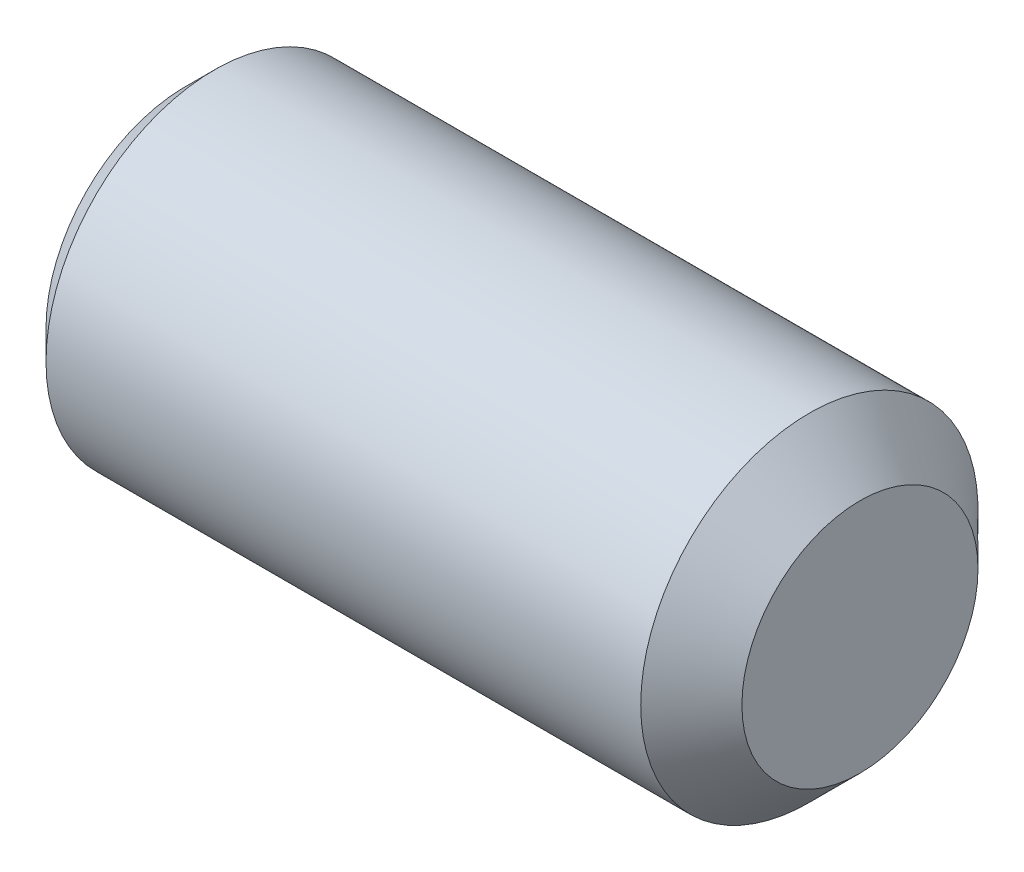
ISO-10303-21;
HEADER;
FILE_DESCRIPTION(('STEP AP214'),'2;1');
FILE_NAME('part.step','',(''),(''),'','','');
FILE_SCHEMA(('AUTOMOTIVE_DESIGN { 1 0 10303 214 1 1 1 1 }'));
ENDSEC;
DATA;
#1=APPLICATION_CONTEXT('core data for automotive mechanical design processes');
#2=APPLICATION_PROTOCOL_DEFINITION('international standard','automotive_design',2000,#1);
#3=PRODUCT_CONTEXT('',#1,'mechanical');
#4=PRODUCT('Part','Part','',(#3));
#5=PRODUCT_RELATED_PRODUCT_CATEGORY('part','',(#4));
#6=PRODUCT_DEFINITION_FORMATION('','',#4);
#7=PRODUCT_DEFINITION_CONTEXT('part definition',#1,'design');
#8=PRODUCT_DEFINITION('design','',#6,#7);
#9=PRODUCT_DEFINITION_SHAPE('','',#8);
#10=(LENGTH_UNIT() NAMED_UNIT(*) SI_UNIT(.MILLI.,.METRE.));
#11=(NAMED_UNIT(*) PLANE_ANGLE_UNIT() SI_UNIT($,.RADIAN.));
#12=(NAMED_UNIT(*) SI_UNIT($,.STERADIAN.) SOLID_ANGLE_UNIT());
#13=UNCERTAINTY_MEASURE_WITH_UNIT(LENGTH_MEASURE(1.E-05),#10,'distance_accuracy_value','');
#14=(GEOMETRIC_REPRESENTATION_CONTEXT(3) GLOBAL_UNCERTAINTY_ASSIGNED_CONTEXT((#13)) GLOBAL_UNIT_ASSIGNED_CONTEXT((#10,
#11,#12)) REPRESENTATION_CONTEXT('',''));
#15=CARTESIAN_POINT('',(0.,0.,0.));
#16=DIRECTION('',(0.,0.,1.));
#17=DIRECTION('',(1.,0.,0.));
#18=AXIS2_PLACEMENT_3D('',#15,#16,#17);
#19=CARTESIAN_POINT('',(2.00000000011369,1.25,2.1650635094611));
#20=DIRECTION('',(-1.,0.,0.));
#21=DIRECTION('',(0.,0.,1.));
#22=AXIS2_PLACEMENT_3D('',#19,#20,#21);
#23=PLANE('',#22);
#24=CARTESIAN_POINT('',(2.00000000011369,0.,0.));
#25=DIRECTION('',(-1.,0.,0.));
#26=DIRECTION('',(0.,0.,1.));
#27=AXIS2_PLACEMENT_3D('',#24,#25,#26);
#28=CIRCLE('',#27,1.25);
#29=CARTESIAN_POINT('',(2.00000000011369,0.625,1.08253175473055));
#30=VERTEX_POINT('',#29);
#31=CARTESIAN_POINT('',(2.00000000011369,1.25,0.));
#32=VERTEX_POINT('',#31);
#33=EDGE_CURVE('E59',#30,#32,#28,.T.);
#34=ORIENTED_EDGE('',*,*,#33,.F.);
#35=DIRECTION('',(0.,0.866025403784439,-0.5));
#36=VECTOR('',#35,1.);
#37=CARTESIAN_POINT('',(2.00000000011369,0.,1.44337567297406));
#38=LINE('',#37,#36);
#39=CARTESIAN_POINT('',(2.00000000011369,1.25,0.721687836487033));
#40=VERTEX_POINT('',#39);
#41=EDGE_CURVE('E269',#30,#40,#38,.T.);
#42=ORIENTED_EDGE('',*,*,#41,.T.);
#43=DIRECTION('',(0.,0.,-1.));
#44=VECTOR('',#43,1.);
#45=CARTESIAN_POINT('',(2.00000000011369,1.25,0.721687836487033));
#46=LINE('',#45,#44);
#47=EDGE_CURVE('E260',#40,#32,#46,.T.);
#48=ORIENTED_EDGE('',*,*,#47,.T.);
#49=EDGE_LOOP('',(#34,#42,#48));
#50=FACE_BOUND('',#49,.T.);
#51=ADVANCED_FACE('F47',(#50),#23,.T.);
#52=CARTESIAN_POINT('',(2.00000000011369,0.625,-1.08253175473055));
#53=VERTEX_POINT('',#52);
#54=EDGE_CURVE('E11',#32,#53,#28,.T.);
#55=ORIENTED_EDGE('',*,*,#54,.F.);
#56=CARTESIAN_POINT('',(2.00000000011369,1.25,-0.721687836487032));
#57=VERTEX_POINT('',#56);
#58=EDGE_CURVE('E264',#32,#57,#46,.T.);
#59=ORIENTED_EDGE('',*,*,#58,.T.);
#60=DIRECTION('',(0.,-0.866025403784439,-0.5));
#61=VECTOR('',#60,1.);
#62=CARTESIAN_POINT('',(2.00000000011369,1.25,-0.721687836487032));
#63=LINE('',#62,#61);
#64=EDGE_CURVE('E255',#57,#53,#63,.T.);
#65=ORIENTED_EDGE('',*,*,#64,.T.);
#66=EDGE_LOOP('',(#55,#59,#65));
#67=FACE_BOUND('',#66,.T.);
#68=ADVANCED_FACE('F135',(#67),#23,.T.);
#69=CARTESIAN_POINT('',(2.00000000011369,-0.624999999999999,-1.08253175473055));
#70=VERTEX_POINT('',#69);
#71=EDGE_CURVE('E57',#53,#70,#28,.T.);
#72=ORIENTED_EDGE('',*,*,#71,.F.);
#73=CARTESIAN_POINT('',(2.00000000011369,0.,-1.44337567297406));
#74=VERTEX_POINT('',#73);
#75=EDGE_CURVE('E259',#53,#74,#63,.T.);
#76=ORIENTED_EDGE('',*,*,#75,.T.);
#77=DIRECTION('',(0.,-0.866025403784439,0.5));
#78=VECTOR('',#77,1.);
#79=CARTESIAN_POINT('',(2.00000000011369,0.,-1.44337567297406));
#80=LINE('',#79,#78);
#81=EDGE_CURVE('E250',#74,#70,#80,.T.);
#82=ORIENTED_EDGE('',*,*,#81,.T.);
#83=EDGE_LOOP('',(#72,#76,#82));
#84=FACE_BOUND('',#83,.T.);
#85=ADVANCED_FACE('F140',(#84),#23,.T.);
#86=CARTESIAN_POINT('',(2.00000000011369,-1.25,0.));
#87=VERTEX_POINT('',#86);
#88=EDGE_CURVE('E307',#70,#87,#28,.T.);
#89=ORIENTED_EDGE('',*,*,#88,.F.);
#90=CARTESIAN_POINT('',(2.00000000011369,-1.25,-0.721687836487033));
#91=VERTEX_POINT('',#90);
#92=EDGE_CURVE('E254',#70,#91,#80,.T.);
#93=ORIENTED_EDGE('',*,*,#92,.T.);
#94=DIRECTION('',(0.,0.,1.));
#95=VECTOR('',#94,1.);
#96=CARTESIAN_POINT('',(2.00000000011369,-1.25,-0.721687836487033));
#97=LINE('',#96,#95);
#98=EDGE_CURVE('E209',#91,#87,#97,.T.);
#99=ORIENTED_EDGE('',*,*,#98,.T.);
#100=EDGE_LOOP('',(#89,#93,#99));
#101=FACE_BOUND('',#100,.T.);
#102=ADVANCED_FACE('F313',(#101),#23,.T.);
#103=CARTESIAN_POINT('',(2.00000000011369,-0.625,1.08253175473055));
#104=VERTEX_POINT('',#103);
#105=EDGE_CURVE('E66',#87,#104,#28,.T.);
#106=ORIENTED_EDGE('',*,*,#105,.F.);
#107=CARTESIAN_POINT('',(2.00000000011369,-1.25,0.721687836487033));
#108=VERTEX_POINT('',#107);
#109=EDGE_CURVE('E249',#87,#108,#97,.T.);
#110=ORIENTED_EDGE('',*,*,#109,.T.);
#111=DIRECTION('',(0.,0.866025403784439,0.5));
#112=VECTOR('',#111,1.);
#113=CARTESIAN_POINT('',(2.00000000011369,-1.25,0.721687836487033));
#114=LINE('',#113,#112);
#115=EDGE_CURVE('E270',#108,#104,#114,.T.);
#116=ORIENTED_EDGE('',*,*,#115,.T.);
#117=EDGE_LOOP('',(#106,#110,#116));
#118=FACE_BOUND('',#117,.T.);
#119=ADVANCED_FACE('F133',(#118),#23,.T.);
#120=CARTESIAN_POINT('',(0.,2.067,0.));
#121=DIRECTION('',(1.,0.,0.));
#122=DIRECTION('',(0.,0.,-1.));
#123=AXIS2_PLACEMENT_3D('',#120,#121,#122);
#124=PLANE('',#123);
#125=DIRECTION('',(0.,0.866025403784439,-0.5));
#126=VECTOR('',#125,1.);
#127=CARTESIAN_POINT('',(1.13686837721616E-10,0.,1.44337567297406));
#128=LINE('',#127,#126);
#129=CARTESIAN_POINT('',(0.,0.,1.44337567297406));
#130=VERTEX_POINT('',#129);
#131=CARTESIAN_POINT('',(1.13686837721616E-10,1.25,0.721687836487033));
#132=VERTEX_POINT('',#131);
#133=EDGE_CURVE('E240',#130,#132,#128,.T.);
#134=ORIENTED_EDGE('',*,*,#133,.F.);
#135=DIRECTION('',(0.,0.866025403784439,0.5));
#136=VECTOR('',#135,1.);
#137=CARTESIAN_POINT('',(1.13686837721616E-10,-1.25,0.721687836487033));
#138=LINE('',#137,#136);
#139=CARTESIAN_POINT('',(1.13686837721616E-10,-1.25,0.721687836487033));
#140=VERTEX_POINT('',#139);
#141=EDGE_CURVE('E74',#140,#130,#138,.T.);
#142=ORIENTED_EDGE('',*,*,#141,.F.);
#143=DIRECTION('',(0.,0.,1.));
#144=VECTOR('',#143,1.);
#145=CARTESIAN_POINT('',(1.13686837721616E-10,-1.25,-0.721687836487033));
#146=LINE('',#145,#144);
#147=CARTESIAN_POINT('',(1.13686837721616E-10,-1.25,-0.721687836487033));
#148=VERTEX_POINT('',#147);
#149=EDGE_CURVE('E223',#148,#140,#146,.T.);
#150=ORIENTED_EDGE('',*,*,#149,.F.);
#151=DIRECTION('',(0.,-0.866025403784439,0.5));
#152=VECTOR('',#151,1.);
#153=CARTESIAN_POINT('',(1.13686837721616E-10,0.,-1.44337567297406));
#154=LINE('',#153,#152);
#155=CARTESIAN_POINT('',(1.13686837721616E-10,0.,-1.44337567297406));
#156=VERTEX_POINT('',#155);
#157=EDGE_CURVE('E228',#156,#148,#154,.T.);
#158=ORIENTED_EDGE('',*,*,#157,.F.);
#159=DIRECTION('',(0.,-0.866025403784439,-0.5));
#160=VECTOR('',#159,1.);
#161=CARTESIAN_POINT('',(1.13686837721616E-10,1.25,-0.721687836487032));
#162=LINE('',#161,#160);
#163=CARTESIAN_POINT('',(1.13686837721616E-10,1.25,-0.721687836487032));
#164=VERTEX_POINT('',#163);
#165=EDGE_CURVE('E232',#164,#156,#162,.T.);
#166=ORIENTED_EDGE('',*,*,#165,.F.);
#167=DIRECTION('',(0.,0.,-1.));
#168=VECTOR('',#167,1.);
#169=CARTESIAN_POINT('',(1.13686837721616E-10,1.25,0.721687836487033));
#170=LINE('',#169,#168);
#171=EDGE_CURVE('E236',#132,#164,#170,.T.);
#172=ORIENTED_EDGE('',*,*,#171,.F.);
#173=EDGE_LOOP('',(#134,#142,#150,#158,#166,#172));
#174=FACE_BOUND('',#173,.T.);
#175=CARTESIAN_POINT('',(0.,0.,0.));
#176=DIRECTION('',(-1.,0.,0.));
#177=DIRECTION('',(0.,0.,1.));
#178=AXIS2_PLACEMENT_3D('',#175,#176,#177);
#179=CIRCLE('',#178,2.067);
#180=CARTESIAN_POINT('',(0.,0.,2.067));
#181=VERTEX_POINT('',#180);
#182=EDGE_CURVE('E198',#181,#181,#179,.T.);
#183=ORIENTED_EDGE('',*,*,#182,.T.);
#184=EDGE_LOOP('',(#183));
#185=FACE_BOUND('',#184,.T.);
#186=ADVANCED_FACE('F49',(#174,#185),#124,.F.);
#187=CARTESIAN_POINT('',(10.,0.,0.));
#188=DIRECTION('',(-1.,0.,0.));
#189=DIRECTION('',(0.,0.,1.));
#190=AXIS2_PLACEMENT_3D('',#187,#188,#189);
#191=PLANE('',#190);
#192=CARTESIAN_POINT('',(10.,0.,0.));
#193=DIRECTION('',(-1.,0.,0.));
#194=DIRECTION('',(0.,0.,1.));
#195=AXIS2_PLACEMENT_3D('',#192,#193,#194);
#196=CIRCLE('',#195,1.75);
#197=CARTESIAN_POINT('',(10.,0.,1.75));
#198=VERTEX_POINT('',#197);
#199=EDGE_CURVE('E51',#198,#198,#196,.T.);
#200=ORIENTED_EDGE('',*,*,#199,.F.);
#201=EDGE_LOOP('',(#200));
#202=FACE_BOUND('',#201,.T.);
#203=ADVANCED_FACE('F176',(#202),#191,.F.);
#204=CARTESIAN_POINT('',(10.,0.,0.));
#205=DIRECTION('',(-1.,0.,0.));
#206=DIRECTION('',(0.,0.,1.));
#207=AXIS2_PLACEMENT_3D('',#204,#205,#206);
#208=CONICAL_SURFACE('',#207,1.75,0.785398163397443);
#209=CARTESIAN_POINT('',(9.24999999999999,0.,0.));
#210=DIRECTION('',(-1.,0.,0.));
#211=DIRECTION('',(0.,0.,1.));
#212=AXIS2_PLACEMENT_3D('',#209,#210,#211);
#213=CIRCLE('',#212,2.5);
#214=CARTESIAN_POINT('',(9.24999999999999,0.,2.5));
#215=VERTEX_POINT('',#214);
#216=EDGE_CURVE('E189',#215,#215,#213,.T.);
#217=ORIENTED_EDGE('',*,*,#216,.F.);
#218=EDGE_LOOP('',(#217));
#219=FACE_BOUND('',#218,.T.);
#220=ORIENTED_EDGE('',*,*,#199,.T.);
#221=EDGE_LOOP('',(#220));
#222=FACE_BOUND('',#221,.T.);
#223=ADVANCED_FACE('F173',(#219,#222),#208,.T.);
#224=CARTESIAN_POINT('',(-10.7450145430878,0.,0.));
#225=DIRECTION('',(-1.,0.,0.));
#226=DIRECTION('',(0.,0.,1.));
#227=AXIS2_PLACEMENT_3D('',#224,#225,#226);
#228=CYLINDRICAL_SURFACE('',#227,2.5);
#229=CARTESIAN_POINT('',(0.433000000000003,0.,0.));
#230=DIRECTION('',(-1.,0.,0.));
#231=DIRECTION('',(0.,0.,1.));
#232=AXIS2_PLACEMENT_3D('',#229,#230,#231);
#233=CIRCLE('',#232,2.5);
#234=CARTESIAN_POINT('',(0.433000000000003,0.,2.5));
#235=VERTEX_POINT('',#234);
#236=EDGE_CURVE('E193',#235,#235,#233,.T.);
#237=ORIENTED_EDGE('',*,*,#236,.F.);
#238=EDGE_LOOP('',(#237));
#239=FACE_BOUND('',#238,.T.);
#240=ORIENTED_EDGE('',*,*,#216,.T.);
#241=EDGE_LOOP('',(#240));
#242=FACE_BOUND('',#241,.T.);
#243=ADVANCED_FACE('F169',(#239,#242),#228,.T.);
#244=CARTESIAN_POINT('',(0.433000000000003,0.,0.));
#245=DIRECTION('',(1.,0.,0.));
#246=DIRECTION('',(0.,0.,-1.));
#247=AXIS2_PLACEMENT_3D('',#244,#245,#246);
#248=CONICAL_SURFACE('',#247,2.5,0.785398163397444);
#249=ORIENTED_EDGE('',*,*,#182,.F.);
#250=EDGE_LOOP('',(#249));
#251=FACE_BOUND('',#250,.T.);
#252=ORIENTED_EDGE('',*,*,#236,.T.);
#253=EDGE_LOOP('',(#252));
#254=FACE_BOUND('',#253,.T.);
#255=ADVANCED_FACE('F166',(#251,#254),#248,.T.);
#256=CARTESIAN_POINT('',(2.00000000011369,-1.25,0.721687836487033));
#257=DIRECTION('',(0.,-0.5,0.866025403784439));
#258=DIRECTION('',(0.,-0.866025403784439,-0.5));
#259=AXIS2_PLACEMENT_3D('',#256,#257,#258);
#260=PLANE('',#259);
#261=ORIENTED_EDGE('',*,*,#141,.T.);
#262=DIRECTION('',(-1.,0.,0.));
#263=VECTOR('',#262,1.);
#264=CARTESIAN_POINT('',(2.00000000011369,0.,1.44337567297406));
#265=LINE('',#264,#263);
#266=CARTESIAN_POINT('',(2.00000000011369,0.,1.44337567297406));
#267=VERTEX_POINT('',#266);
#268=EDGE_CURVE('E205',#267,#130,#265,.T.);
#269=ORIENTED_EDGE('',*,*,#268,.F.);
#270=EDGE_CURVE('E227',#104,#267,#114,.T.);
#271=ORIENTED_EDGE('',*,*,#270,.F.);
#272=ORIENTED_EDGE('',*,*,#115,.F.);
#273=DIRECTION('',(-1.,0.,0.));
#274=VECTOR('',#273,1.);
#275=CARTESIAN_POINT('',(2.00000000011369,-1.25,0.721687836487033));
#276=LINE('',#275,#274);
#277=EDGE_CURVE('E204',#108,#140,#276,.T.);
#278=ORIENTED_EDGE('',*,*,#277,.T.);
#279=EDGE_LOOP('',(#261,#269,#271,#272,#278));
#280=FACE_BOUND('',#279,.T.);
#281=ADVANCED_FACE('F148',(#280),#260,.F.);
#282=CARTESIAN_POINT('',(2.00000000011369,-1.25,-0.721687836487033));
#283=DIRECTION('',(0.,-1.,0.));
#284=DIRECTION('',(0.,0.,-1.));
#285=AXIS2_PLACEMENT_3D('',#282,#283,#284);
#286=PLANE('',#285);
#287=ORIENTED_EDGE('',*,*,#149,.T.);
#288=ORIENTED_EDGE('',*,*,#277,.F.);
#289=ORIENTED_EDGE('',*,*,#109,.F.);
#290=ORIENTED_EDGE('',*,*,#98,.F.);
#291=DIRECTION('',(-1.,0.,0.));
#292=VECTOR('',#291,1.);
#293=CARTESIAN_POINT('',(2.00000000011369,-1.25,-0.721687836487033));
#294=LINE('',#293,#292);
#295=EDGE_CURVE('E218',#91,#148,#294,.T.);
#296=ORIENTED_EDGE('',*,*,#295,.T.);
#297=EDGE_LOOP('',(#287,#288,#289,#290,#296));
#298=FACE_BOUND('',#297,.T.);
#299=ADVANCED_FACE('F144',(#298),#286,.F.);
#300=CARTESIAN_POINT('',(2.00000000011369,0.,-1.44337567297406));
#301=DIRECTION('',(0.,-0.499999999999999,-0.866025403784439));
#302=DIRECTION('',(0.,0.866025403784439,-0.5));
#303=AXIS2_PLACEMENT_3D('',#300,#301,#302);
#304=PLANE('',#303);
#305=ORIENTED_EDGE('',*,*,#157,.T.);
#306=ORIENTED_EDGE('',*,*,#295,.F.);
#307=ORIENTED_EDGE('',*,*,#92,.F.);
#308=ORIENTED_EDGE('',*,*,#81,.F.);
#309=DIRECTION('',(-1.,0.,0.));
#310=VECTOR('',#309,1.);
#311=CARTESIAN_POINT('',(2.00000000011369,0.,-1.44337567297406));
#312=LINE('',#311,#310);
#313=EDGE_CURVE('E215',#74,#156,#312,.T.);
#314=ORIENTED_EDGE('',*,*,#313,.T.);
#315=EDGE_LOOP('',(#305,#306,#307,#308,#314));
#316=FACE_BOUND('',#315,.T.);
#317=ADVANCED_FACE('F147',(#316),#304,.F.);
#318=CARTESIAN_POINT('',(2.00000000011369,1.25,-0.721687836487032));
#319=DIRECTION('',(0.,0.5,-0.866025403784439));
#320=DIRECTION('',(0.,0.866025403784439,0.5));
#321=AXIS2_PLACEMENT_3D('',#318,#319,#320);
#322=PLANE('',#321);
#323=ORIENTED_EDGE('',*,*,#165,.T.);
#324=ORIENTED_EDGE('',*,*,#313,.F.);
#325=ORIENTED_EDGE('',*,*,#75,.F.);
#326=ORIENTED_EDGE('',*,*,#64,.F.);
#327=DIRECTION('',(-1.,0.,0.));
#328=VECTOR('',#327,1.);
#329=CARTESIAN_POINT('',(2.00000000011369,1.25,-0.721687836487032));
#330=LINE('',#329,#328);
#331=EDGE_CURVE('E212',#57,#164,#330,.T.);
#332=ORIENTED_EDGE('',*,*,#331,.T.);
#333=EDGE_LOOP('',(#323,#324,#325,#326,#332));
#334=FACE_BOUND('',#333,.T.);
#335=ADVANCED_FACE('F152',(#334),#322,.F.);
#336=CARTESIAN_POINT('',(2.00000000011369,1.25,0.721687836487033));
#337=DIRECTION('',(0.,1.,0.));
#338=DIRECTION('',(0.,0.,1.));
#339=AXIS2_PLACEMENT_3D('',#336,#337,#338);
#340=PLANE('',#339);
#341=ORIENTED_EDGE('',*,*,#171,.T.);
#342=ORIENTED_EDGE('',*,*,#331,.F.);
#343=ORIENTED_EDGE('',*,*,#58,.F.);
#344=ORIENTED_EDGE('',*,*,#47,.F.);
#345=DIRECTION('',(-1.,0.,0.));
#346=VECTOR('',#345,1.);
#347=CARTESIAN_POINT('',(2.00000000011369,1.25,0.721687836487033));
#348=LINE('',#347,#346);
#349=EDGE_CURVE('E208',#40,#132,#348,.T.);
#350=ORIENTED_EDGE('',*,*,#349,.T.);
#351=EDGE_LOOP('',(#341,#342,#343,#344,#350));
#352=FACE_BOUND('',#351,.T.);
#353=ADVANCED_FACE('F156',(#352),#340,.F.);
#354=CARTESIAN_POINT('',(2.00000000011369,0.,1.44337567297406));
#355=DIRECTION('',(0.,0.5,0.866025403784439));
#356=DIRECTION('',(0.,-0.866025403784439,0.5));
#357=AXIS2_PLACEMENT_3D('',#354,#355,#356);
#358=PLANE('',#357);
#359=ORIENTED_EDGE('',*,*,#133,.T.);
#360=ORIENTED_EDGE('',*,*,#349,.F.);
#361=ORIENTED_EDGE('',*,*,#41,.F.);
#362=EDGE_CURVE('E265',#267,#30,#38,.T.);
#363=ORIENTED_EDGE('',*,*,#362,.F.);
#364=ORIENTED_EDGE('',*,*,#268,.T.);
#365=EDGE_LOOP('',(#359,#360,#361,#363,#364));
#366=FACE_BOUND('',#365,.T.);
#367=ADVANCED_FACE('F130',(#366),#358,.F.);
#368=EDGE_CURVE('E188',#104,#30,#28,.T.);
#369=ORIENTED_EDGE('',*,*,#368,.F.);
#370=ORIENTED_EDGE('',*,*,#270,.T.);
#371=ORIENTED_EDGE('',*,*,#362,.T.);
#372=EDGE_LOOP('',(#369,#370,#371));
#373=FACE_BOUND('',#372,.T.);
#374=ADVANCED_FACE('F125',(#373),#23,.T.);
#375=CARTESIAN_POINT('',(2.72168783660072,0.,0.));
#376=DIRECTION('',(-1.,0.,0.));
#377=DIRECTION('',(0.,0.,1.));
#378=AXIS2_PLACEMENT_3D('',#375,#376,#377);
#379=CONICAL_SURFACE('',#378,0.,1.0471975511966);
#380=ORIENTED_EDGE('',*,*,#33,.T.);
#381=ORIENTED_EDGE('',*,*,#54,.T.);
#382=ORIENTED_EDGE('',*,*,#71,.T.);
#383=ORIENTED_EDGE('',*,*,#88,.T.);
#384=ORIENTED_EDGE('',*,*,#105,.T.);
#385=ORIENTED_EDGE('',*,*,#368,.T.);
#386=EDGE_LOOP('',(#380,#381,#382,#383,#384,#385));
#387=FACE_BOUND('',#386,.T.);
#388=CARTESIAN_POINT('',(2.72168783660072,0.,0.));
#389=VERTEX_POINT('',#388);
#390=VERTEX_LOOP('',#389);
#391=FACE_BOUND('',#390,.T.);
#392=ADVANCED_FACE('F123',(#387,#391),#379,.F.);
#393=CLOSED_SHELL('',(#51,#68,#85,#102,#119,#186,#203,#223,#243,#255,#281,#299,#317,#335,#353,
#367,#374,#392));
#394=MANIFOLD_SOLID_BREP('B2',#393);
#395=ADVANCED_BREP_SHAPE_REPRESENTATION('',(#18,#394),#14);
#396=SHAPE_DEFINITION_REPRESENTATION(#9,#395);
ENDSEC;
END-ISO-10303-21;
